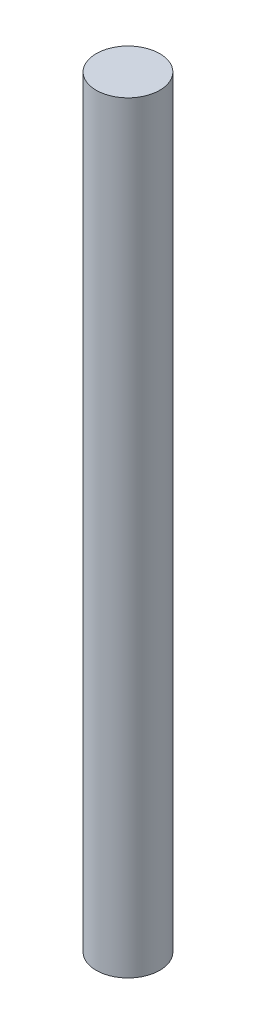
ISO-10303-21;
HEADER;
FILE_DESCRIPTION(('STEP AP214'),'2;1');
FILE_NAME('part.step','',(''),(''),'','','');
FILE_SCHEMA(('AUTOMOTIVE_DESIGN { 1 0 10303 214 1 1 1 1 }'));
ENDSEC;
DATA;
#1=APPLICATION_CONTEXT('core data for automotive mechanical design processes');
#2=APPLICATION_PROTOCOL_DEFINITION('international standard','automotive_design',2000,#1);
#3=PRODUCT_CONTEXT('',#1,'mechanical');
#4=PRODUCT('Part','Part','',(#3));
#5=PRODUCT_RELATED_PRODUCT_CATEGORY('part','',(#4));
#6=PRODUCT_DEFINITION_FORMATION('','',#4);
#7=PRODUCT_DEFINITION_CONTEXT('part definition',#1,'design');
#8=PRODUCT_DEFINITION('design','',#6,#7);
#9=PRODUCT_DEFINITION_SHAPE('','',#8);
#10=(LENGTH_UNIT() NAMED_UNIT(*) SI_UNIT(.MILLI.,.METRE.));
#11=(NAMED_UNIT(*) PLANE_ANGLE_UNIT() SI_UNIT($,.RADIAN.));
#12=(NAMED_UNIT(*) SI_UNIT($,.STERADIAN.) SOLID_ANGLE_UNIT());
#13=UNCERTAINTY_MEASURE_WITH_UNIT(LENGTH_MEASURE(1.E-05),#10,'distance_accuracy_value','');
#14=(GEOMETRIC_REPRESENTATION_CONTEXT(3) GLOBAL_UNCERTAINTY_ASSIGNED_CONTEXT((#13)) GLOBAL_UNIT_ASSIGNED_CONTEXT((#10,
#11,#12)) REPRESENTATION_CONTEXT('',''));
#15=CARTESIAN_POINT('',(0.,0.,0.));
#16=DIRECTION('',(0.,0.,1.));
#17=DIRECTION('',(1.,0.,0.));
#18=AXIS2_PLACEMENT_3D('',#15,#16,#17);
#19=CARTESIAN_POINT('',(0.,96.,0.));
#20=DIRECTION('',(0.,-1.,0.));
#21=DIRECTION('',(0.,0.,-1.));
#22=AXIS2_PLACEMENT_3D('',#19,#20,#21);
#23=CYLINDRICAL_SURFACE('',#22,4.);
#24=CARTESIAN_POINT('',(0.,96.,0.));
#25=DIRECTION('',(0.,1.,0.));
#26=DIRECTION('',(0.,0.,1.));
#27=AXIS2_PLACEMENT_3D('',#24,#25,#26);
#28=CIRCLE('',#27,4.);
#29=CARTESIAN_POINT('',(0.,96.,4.));
#30=VERTEX_POINT('',#29);
#31=EDGE_CURVE('E10',#30,#30,#28,.T.);
#32=ORIENTED_EDGE('',*,*,#31,.F.);
#33=EDGE_LOOP('',(#32));
#34=FACE_BOUND('',#33,.T.);
#35=CARTESIAN_POINT('',(0.,0.,0.));
#36=DIRECTION('',(0.,1.,0.));
#37=DIRECTION('',(0.,0.,1.));
#38=AXIS2_PLACEMENT_3D('',#35,#36,#37);
#39=CIRCLE('',#38,4.);
#40=CARTESIAN_POINT('',(0.,0.,4.));
#41=VERTEX_POINT('',#40);
#42=EDGE_CURVE('E36',#41,#41,#39,.T.);
#43=ORIENTED_EDGE('',*,*,#42,.T.);
#44=EDGE_LOOP('',(#43));
#45=FACE_BOUND('',#44,.T.);
#46=ADVANCED_FACE('F33',(#34,#45),#23,.T.);
#47=CARTESIAN_POINT('',(0.,96.,0.));
#48=DIRECTION('',(0.,1.,0.));
#49=DIRECTION('',(0.,0.,1.));
#50=AXIS2_PLACEMENT_3D('',#47,#48,#49);
#51=PLANE('',#50);
#52=ORIENTED_EDGE('',*,*,#31,.T.);
#53=EDGE_LOOP('',(#52));
#54=FACE_BOUND('',#53,.T.);
#55=ADVANCED_FACE('F48',(#54),#51,.T.);
#56=CARTESIAN_POINT('',(0.,0.,0.));
#57=DIRECTION('',(0.,1.,0.));
#58=DIRECTION('',(0.,0.,1.));
#59=AXIS2_PLACEMENT_3D('',#56,#57,#58);
#60=PLANE('',#59);
#61=ORIENTED_EDGE('',*,*,#42,.F.);
#62=EDGE_LOOP('',(#61));
#63=FACE_BOUND('',#62,.T.);
#64=ADVANCED_FACE('F46',(#63),#60,.F.);
#65=CLOSED_SHELL('',(#46,#55,#64));
#66=MANIFOLD_SOLID_BREP('B2',#65);
#67=ADVANCED_BREP_SHAPE_REPRESENTATION('',(#18,#66),#14);
#68=SHAPE_DEFINITION_REPRESENTATION(#9,#67);
ENDSEC;
END-ISO-10303-21;
